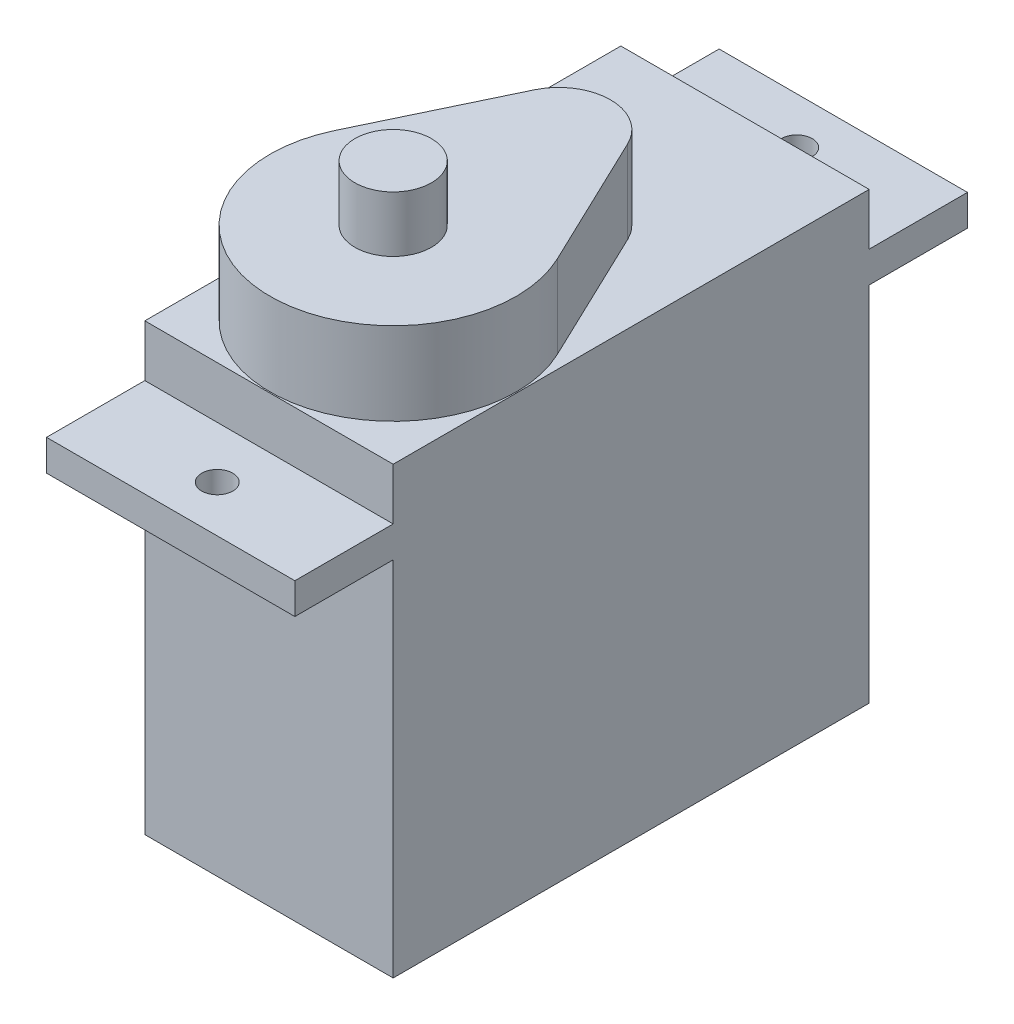
ISO-10303-21;
HEADER;
FILE_DESCRIPTION(('STEP AP214'),'2;1');
FILE_NAME('part.step','',(''),(''),'','','');
FILE_SCHEMA(('AUTOMOTIVE_DESIGN { 1 0 10303 214 1 1 1 1 }'));
ENDSEC;
DATA;
#1=APPLICATION_CONTEXT('core data for automotive mechanical design processes');
#2=APPLICATION_PROTOCOL_DEFINITION('international standard','automotive_design',2000,#1);
#3=PRODUCT_CONTEXT('',#1,'mechanical');
#4=PRODUCT('Part','Part','',(#3));
#5=PRODUCT_RELATED_PRODUCT_CATEGORY('part','',(#4));
#6=PRODUCT_DEFINITION_FORMATION('','',#4);
#7=PRODUCT_DEFINITION_CONTEXT('part definition',#1,'design');
#8=PRODUCT_DEFINITION('design','',#6,#7);
#9=PRODUCT_DEFINITION_SHAPE('','',#8);
#10=(LENGTH_UNIT() NAMED_UNIT(*) SI_UNIT(.MILLI.,.METRE.));
#11=(NAMED_UNIT(*) PLANE_ANGLE_UNIT() SI_UNIT($,.RADIAN.));
#12=(NAMED_UNIT(*) SI_UNIT($,.STERADIAN.) SOLID_ANGLE_UNIT());
#13=UNCERTAINTY_MEASURE_WITH_UNIT(LENGTH_MEASURE(1.E-05),#10,'distance_accuracy_value','');
#14=(GEOMETRIC_REPRESENTATION_CONTEXT(3) GLOBAL_UNCERTAINTY_ASSIGNED_CONTEXT((#13)) GLOBAL_UNIT_ASSIGNED_CONTEXT((#10,
#11,#12)) REPRESENTATION_CONTEXT('',''));
#15=CARTESIAN_POINT('',(0.,0.,0.));
#16=DIRECTION('',(0.,0.,1.));
#17=DIRECTION('',(1.,0.,0.));
#18=AXIS2_PLACEMENT_3D('',#15,#16,#17);
#19=CARTESIAN_POINT('',(12.,21.5,0.));
#20=DIRECTION('',(0.,-1.,0.));
#21=DIRECTION('',(0.,0.,-1.));
#22=AXIS2_PLACEMENT_3D('',#19,#20,#21);
#23=PLANE('',#22);
#24=DIRECTION('',(0.,0.,1.));
#25=VECTOR('',#24,1.);
#26=CARTESIAN_POINT('',(0.,21.5,0.));
#27=LINE('',#26,#25);
#28=CARTESIAN_POINT('',(0.,21.5,-23.));
#29=VERTEX_POINT('',#28);
#30=CARTESIAN_POINT('',(0.,21.5,0.));
#31=VERTEX_POINT('',#30);
#32=EDGE_CURVE('E244',#29,#31,#27,.T.);
#33=ORIENTED_EDGE('',*,*,#32,.T.);
#34=DIRECTION('',(-1.,0.,0.));
#35=VECTOR('',#34,1.);
#36=CARTESIAN_POINT('',(12.,21.5,0.));
#37=LINE('',#36,#35);
#38=CARTESIAN_POINT('',(12.,21.5,0.));
#39=VERTEX_POINT('',#38);
#40=EDGE_CURVE('E273',#39,#31,#37,.T.);
#41=ORIENTED_EDGE('',*,*,#40,.F.);
#42=DIRECTION('',(0.,0.,1.));
#43=VECTOR('',#42,1.);
#44=CARTESIAN_POINT('',(12.,21.5,0.));
#45=LINE('',#44,#43);
#46=CARTESIAN_POINT('',(12.,21.5,-23.));
#47=VERTEX_POINT('',#46);
#48=EDGE_CURVE('E211',#47,#39,#45,.T.);
#49=ORIENTED_EDGE('',*,*,#48,.F.);
#50=DIRECTION('',(-1.,0.,0.));
#51=VECTOR('',#50,1.);
#52=CARTESIAN_POINT('',(12.,21.5,-23.));
#53=LINE('',#52,#51);
#54=EDGE_CURVE('E277',#47,#29,#53,.T.);
#55=ORIENTED_EDGE('',*,*,#54,.T.);
#56=EDGE_LOOP('',(#33,#41,#49,#55));
#57=FACE_BOUND('',#56,.T.);
#58=CARTESIAN_POINT('',(6.,21.5,-14.));
#59=DIRECTION('',(0.,1.,0.));
#60=DIRECTION('',(0.,0.,1.));
#61=AXIS2_PLACEMENT_3D('',#58,#59,#60);
#62=CIRCLE('',#61,2.5);
#63=CARTESIAN_POINT('',(8.25558118549854,21.5,-15.078125));
#64=VERTEX_POINT('',#63);
#65=CARTESIAN_POINT('',(3.74441881450146,21.5,-15.078125));
#66=VERTEX_POINT('',#65);
#67=EDGE_CURVE('E56',#64,#66,#62,.T.);
#68=ORIENTED_EDGE('',*,*,#67,.F.);
#69=DIRECTION('',(-0.43125,0.,-0.902232474199416));
#70=VECTOR('',#69,1.);
#71=CARTESIAN_POINT('',(8.25558118549854,21.5,-15.078125));
#72=LINE('',#71,#70);
#73=CARTESIAN_POINT('',(11.3682832214865,21.5,-8.5659375));
#74=VERTEX_POINT('',#73);
#75=EDGE_CURVE('E60',#74,#64,#72,.T.);
#76=ORIENTED_EDGE('',*,*,#75,.F.);
#77=CARTESIAN_POINT('',(6.,21.5,-6.));
#78=DIRECTION('',(0.,1.,0.));
#79=DIRECTION('',(0.,0.,1.));
#80=AXIS2_PLACEMENT_3D('',#77,#78,#79);
#81=CIRCLE('',#80,5.95);
#82=CARTESIAN_POINT('',(0.631716778513474,21.5,-8.5659375));
#83=VERTEX_POINT('',#82);
#84=EDGE_CURVE('E457',#83,#74,#81,.T.);
#85=ORIENTED_EDGE('',*,*,#84,.F.);
#86=DIRECTION('',(-0.43125,0.,0.902232474199416));
#87=VECTOR('',#86,1.);
#88=CARTESIAN_POINT('',(3.74441881450146,21.5,-15.078125));
#89=LINE('',#88,#87);
#90=EDGE_CURVE('E454',#66,#83,#89,.T.);
#91=ORIENTED_EDGE('',*,*,#90,.F.);
#92=EDGE_LOOP('',(#68,#76,#85,#91));
#93=FACE_BOUND('',#92,.T.);
#94=ADVANCED_FACE('F39',(#57,#93),#23,.F.);
#95=CARTESIAN_POINT('',(12.,0.,0.));
#96=DIRECTION('',(0.,0.,-1.));
#97=DIRECTION('',(-1.,0.,0.));
#98=AXIS2_PLACEMENT_3D('',#95,#96,#97);
#99=PLANE('',#98);
#100=DIRECTION('',(0.,-1.,0.));
#101=VECTOR('',#100,1.);
#102=CARTESIAN_POINT('',(0.,0.,0.));
#103=LINE('',#102,#101);
#104=CARTESIAN_POINT('',(0.,17.5,0.));
#105=VERTEX_POINT('',#104);
#106=CARTESIAN_POINT('',(0.,0.,0.));
#107=VERTEX_POINT('',#106);
#108=EDGE_CURVE('E177',#105,#107,#103,.T.);
#109=ORIENTED_EDGE('',*,*,#108,.T.);
#110=DIRECTION('',(-1.,0.,0.));
#111=VECTOR('',#110,1.);
#112=CARTESIAN_POINT('',(12.,0.,0.));
#113=LINE('',#112,#111);
#114=CARTESIAN_POINT('',(12.,0.,0.));
#115=VERTEX_POINT('',#114);
#116=EDGE_CURVE('E11',#115,#107,#113,.T.);
#117=ORIENTED_EDGE('',*,*,#116,.F.);
#118=DIRECTION('',(0.,-1.,0.));
#119=VECTOR('',#118,1.);
#120=CARTESIAN_POINT('',(12.,0.,0.));
#121=LINE('',#120,#119);
#122=CARTESIAN_POINT('',(12.,17.5,0.));
#123=VERTEX_POINT('',#122);
#124=EDGE_CURVE('E188',#123,#115,#121,.T.);
#125=ORIENTED_EDGE('',*,*,#124,.F.);
#126=DIRECTION('',(-1.,0.,0.));
#127=VECTOR('',#126,1.);
#128=CARTESIAN_POINT('',(12.,17.5,0.));
#129=LINE('',#128,#127);
#130=EDGE_CURVE('E225',#123,#105,#129,.T.);
#131=ORIENTED_EDGE('',*,*,#130,.T.);
#132=EDGE_LOOP('',(#109,#117,#125,#131));
#133=FACE_BOUND('',#132,.T.);
#134=ADVANCED_FACE('F41',(#133),#99,.F.);
#135=CARTESIAN_POINT('',(12.,0.,0.));
#136=DIRECTION('',(0.,1.,0.));
#137=DIRECTION('',(0.,0.,1.));
#138=AXIS2_PLACEMENT_3D('',#135,#136,#137);
#139=PLANE('',#138);
#140=DIRECTION('',(0.,0.,-1.));
#141=VECTOR('',#140,1.);
#142=CARTESIAN_POINT('',(0.,0.,0.));
#143=LINE('',#142,#141);
#144=CARTESIAN_POINT('',(0.,0.,-23.));
#145=VERTEX_POINT('',#144);
#146=EDGE_CURVE('E182',#107,#145,#143,.T.);
#147=ORIENTED_EDGE('',*,*,#146,.T.);
#148=DIRECTION('',(-1.,0.,0.));
#149=VECTOR('',#148,1.);
#150=CARTESIAN_POINT('',(12.,0.,-23.));
#151=LINE('',#150,#149);
#152=CARTESIAN_POINT('',(12.,0.,-23.));
#153=VERTEX_POINT('',#152);
#154=EDGE_CURVE('E49',#153,#145,#151,.T.);
#155=ORIENTED_EDGE('',*,*,#154,.F.);
#156=DIRECTION('',(0.,0.,-1.));
#157=VECTOR('',#156,1.);
#158=CARTESIAN_POINT('',(12.,0.,0.));
#159=LINE('',#158,#157);
#160=EDGE_CURVE('E192',#115,#153,#159,.T.);
#161=ORIENTED_EDGE('',*,*,#160,.F.);
#162=ORIENTED_EDGE('',*,*,#116,.T.);
#163=EDGE_LOOP('',(#147,#155,#161,#162));
#164=FACE_BOUND('',#163,.T.);
#165=ADVANCED_FACE('F326',(#164),#139,.F.);
#166=CARTESIAN_POINT('',(12.,0.,-23.));
#167=DIRECTION('',(0.,0.,1.));
#168=DIRECTION('',(0.,-1.,0.));
#169=AXIS2_PLACEMENT_3D('',#166,#167,#168);
#170=PLANE('',#169);
#171=DIRECTION('',(0.,1.,0.));
#172=VECTOR('',#171,1.);
#173=CARTESIAN_POINT('',(0.,0.,-23.));
#174=LINE('',#173,#172);
#175=CARTESIAN_POINT('',(0.,17.5,-23.));
#176=VERTEX_POINT('',#175);
#177=EDGE_CURVE('E229',#145,#176,#174,.T.);
#178=ORIENTED_EDGE('',*,*,#177,.T.);
#179=DIRECTION('',(-1.,0.,0.));
#180=VECTOR('',#179,1.);
#181=CARTESIAN_POINT('',(12.,17.5,-23.));
#182=LINE('',#181,#180);
#183=CARTESIAN_POINT('',(12.,17.5,-23.));
#184=VERTEX_POINT('',#183);
#185=EDGE_CURVE('E293',#184,#176,#182,.T.);
#186=ORIENTED_EDGE('',*,*,#185,.F.);
#187=DIRECTION('',(0.,1.,0.));
#188=VECTOR('',#187,1.);
#189=CARTESIAN_POINT('',(12.,0.,-23.));
#190=LINE('',#189,#188);
#191=EDGE_CURVE('E196',#153,#184,#190,.T.);
#192=ORIENTED_EDGE('',*,*,#191,.F.);
#193=ORIENTED_EDGE('',*,*,#154,.T.);
#194=EDGE_LOOP('',(#178,#186,#192,#193));
#195=FACE_BOUND('',#194,.T.);
#196=ADVANCED_FACE('F303',(#195),#170,.F.);
#197=CARTESIAN_POINT('',(12.,17.5,-23.));
#198=DIRECTION('',(0.,1.,0.));
#199=DIRECTION('',(0.,0.,1.));
#200=AXIS2_PLACEMENT_3D('',#197,#198,#199);
#201=PLANE('',#200);
#202=CARTESIAN_POINT('',(6.,17.5,-25.5));
#203=DIRECTION('',(0.,1.,0.));
#204=DIRECTION('',(0.,0.,1.));
#205=AXIS2_PLACEMENT_3D('',#202,#203,#204);
#206=CIRCLE('',#205,0.75);
#207=CARTESIAN_POINT('',(6.,17.5,-24.75));
#208=VERTEX_POINT('',#207);
#209=EDGE_CURVE('E428',#208,#208,#206,.T.);
#210=ORIENTED_EDGE('',*,*,#209,.T.);
#211=EDGE_LOOP('',(#210));
#212=FACE_BOUND('',#211,.T.);
#213=DIRECTION('',(0.,0.,-1.));
#214=VECTOR('',#213,1.);
#215=CARTESIAN_POINT('',(0.,17.5,-23.));
#216=LINE('',#215,#214);
#217=CARTESIAN_POINT('',(0.,17.5,-27.75));
#218=VERTEX_POINT('',#217);
#219=EDGE_CURVE('E232',#176,#218,#216,.T.);
#220=ORIENTED_EDGE('',*,*,#219,.T.);
#221=DIRECTION('',(-1.,0.,0.));
#222=VECTOR('',#221,1.);
#223=CARTESIAN_POINT('',(12.,17.5,-27.75));
#224=LINE('',#223,#222);
#225=CARTESIAN_POINT('',(12.,17.5,-27.75));
#226=VERTEX_POINT('',#225);
#227=EDGE_CURVE('E289',#226,#218,#224,.T.);
#228=ORIENTED_EDGE('',*,*,#227,.F.);
#229=DIRECTION('',(0.,0.,-1.));
#230=VECTOR('',#229,1.);
#231=CARTESIAN_POINT('',(12.,17.5,-23.));
#232=LINE('',#231,#230);
#233=EDGE_CURVE('E199',#184,#226,#232,.T.);
#234=ORIENTED_EDGE('',*,*,#233,.F.);
#235=ORIENTED_EDGE('',*,*,#185,.T.);
#236=EDGE_LOOP('',(#220,#228,#234,#235));
#237=FACE_BOUND('',#236,.T.);
#238=ADVANCED_FACE('F314',(#212,#237),#201,.F.);
#239=CARTESIAN_POINT('',(12.,19.,-27.75));
#240=DIRECTION('',(0.,0.,1.));
#241=DIRECTION('',(1.,0.,0.));
#242=AXIS2_PLACEMENT_3D('',#239,#240,#241);
#243=PLANE('',#242);
#244=DIRECTION('',(0.,1.,0.));
#245=VECTOR('',#244,1.);
#246=CARTESIAN_POINT('',(0.,19.,-27.75));
#247=LINE('',#246,#245);
#248=CARTESIAN_POINT('',(0.,19.,-27.75));
#249=VERTEX_POINT('',#248);
#250=EDGE_CURVE('E235',#218,#249,#247,.T.);
#251=ORIENTED_EDGE('',*,*,#250,.T.);
#252=DIRECTION('',(-1.,0.,0.));
#253=VECTOR('',#252,1.);
#254=CARTESIAN_POINT('',(12.,19.,-27.75));
#255=LINE('',#254,#253);
#256=CARTESIAN_POINT('',(12.,19.,-27.75));
#257=VERTEX_POINT('',#256);
#258=EDGE_CURVE('E285',#257,#249,#255,.T.);
#259=ORIENTED_EDGE('',*,*,#258,.F.);
#260=DIRECTION('',(0.,1.,0.));
#261=VECTOR('',#260,1.);
#262=CARTESIAN_POINT('',(12.,19.,-27.75));
#263=LINE('',#262,#261);
#264=EDGE_CURVE('E202',#226,#257,#263,.T.);
#265=ORIENTED_EDGE('',*,*,#264,.F.);
#266=ORIENTED_EDGE('',*,*,#227,.T.);
#267=EDGE_LOOP('',(#251,#259,#265,#266));
#268=FACE_BOUND('',#267,.T.);
#269=ADVANCED_FACE('F318',(#268),#243,.F.);
#270=CARTESIAN_POINT('',(12.,19.,-23.));
#271=DIRECTION('',(0.,-1.,0.));
#272=DIRECTION('',(0.,0.,-1.));
#273=AXIS2_PLACEMENT_3D('',#270,#271,#272);
#274=PLANE('',#273);
#275=CARTESIAN_POINT('',(6.,19.,-25.5));
#276=DIRECTION('',(0.,1.,0.));
#277=DIRECTION('',(0.,0.,1.));
#278=AXIS2_PLACEMENT_3D('',#275,#276,#277);
#279=CIRCLE('',#278,0.75);
#280=CARTESIAN_POINT('',(6.,19.,-24.75));
#281=VERTEX_POINT('',#280);
#282=EDGE_CURVE('E434',#281,#281,#279,.T.);
#283=ORIENTED_EDGE('',*,*,#282,.F.);
#284=EDGE_LOOP('',(#283));
#285=FACE_BOUND('',#284,.T.);
#286=DIRECTION('',(0.,0.,1.));
#287=VECTOR('',#286,1.);
#288=CARTESIAN_POINT('',(0.,19.,-23.));
#289=LINE('',#288,#287);
#290=CARTESIAN_POINT('',(0.,19.,-23.));
#291=VERTEX_POINT('',#290);
#292=EDGE_CURVE('E238',#249,#291,#289,.T.);
#293=ORIENTED_EDGE('',*,*,#292,.T.);
#294=DIRECTION('',(-1.,0.,0.));
#295=VECTOR('',#294,1.);
#296=CARTESIAN_POINT('',(12.,19.,-23.));
#297=LINE('',#296,#295);
#298=CARTESIAN_POINT('',(12.,19.,-23.));
#299=VERTEX_POINT('',#298);
#300=EDGE_CURVE('E281',#299,#291,#297,.T.);
#301=ORIENTED_EDGE('',*,*,#300,.F.);
#302=DIRECTION('',(0.,0.,1.));
#303=VECTOR('',#302,1.);
#304=CARTESIAN_POINT('',(12.,19.,-23.));
#305=LINE('',#304,#303);
#306=EDGE_CURVE('E205',#257,#299,#305,.T.);
#307=ORIENTED_EDGE('',*,*,#306,.F.);
#308=ORIENTED_EDGE('',*,*,#258,.T.);
#309=EDGE_LOOP('',(#293,#301,#307,#308));
#310=FACE_BOUND('',#309,.T.);
#311=ADVANCED_FACE('F358',(#285,#310),#274,.F.);
#312=CARTESIAN_POINT('',(12.,19.,-23.));
#313=DIRECTION('',(0.,0.,1.));
#314=DIRECTION('',(1.,0.,0.));
#315=AXIS2_PLACEMENT_3D('',#312,#313,#314);
#316=PLANE('',#315);
#317=DIRECTION('',(0.,1.,0.));
#318=VECTOR('',#317,1.);
#319=CARTESIAN_POINT('',(0.,19.,-23.));
#320=LINE('',#319,#318);
#321=EDGE_CURVE('E241',#291,#29,#320,.T.);
#322=ORIENTED_EDGE('',*,*,#321,.T.);
#323=ORIENTED_EDGE('',*,*,#54,.F.);
#324=DIRECTION('',(0.,1.,0.));
#325=VECTOR('',#324,1.);
#326=CARTESIAN_POINT('',(12.,19.,-23.));
#327=LINE('',#326,#325);
#328=EDGE_CURVE('E208',#299,#47,#327,.T.);
#329=ORIENTED_EDGE('',*,*,#328,.F.);
#330=ORIENTED_EDGE('',*,*,#300,.T.);
#331=EDGE_LOOP('',(#322,#323,#329,#330));
#332=FACE_BOUND('',#331,.T.);
#333=ADVANCED_FACE('F356',(#332),#316,.F.);
#334=CARTESIAN_POINT('',(12.,19.,0.));
#335=DIRECTION('',(0.,0.,-1.));
#336=DIRECTION('',(-1.,0.,0.));
#337=AXIS2_PLACEMENT_3D('',#334,#335,#336);
#338=PLANE('',#337);
#339=DIRECTION('',(0.,-1.,0.));
#340=VECTOR('',#339,1.);
#341=CARTESIAN_POINT('',(0.,19.,0.));
#342=LINE('',#341,#340);
#343=CARTESIAN_POINT('',(0.,19.,0.));
#344=VERTEX_POINT('',#343);
#345=EDGE_CURVE('E247',#31,#344,#342,.T.);
#346=ORIENTED_EDGE('',*,*,#345,.T.);
#347=DIRECTION('',(-1.,0.,0.));
#348=VECTOR('',#347,1.);
#349=CARTESIAN_POINT('',(12.,19.,0.));
#350=LINE('',#349,#348);
#351=CARTESIAN_POINT('',(12.,19.,0.));
#352=VERTEX_POINT('',#351);
#353=EDGE_CURVE('E269',#352,#344,#350,.T.);
#354=ORIENTED_EDGE('',*,*,#353,.F.);
#355=DIRECTION('',(0.,-1.,0.));
#356=VECTOR('',#355,1.);
#357=CARTESIAN_POINT('',(12.,19.,0.));
#358=LINE('',#357,#356);
#359=EDGE_CURVE('E214',#39,#352,#358,.T.);
#360=ORIENTED_EDGE('',*,*,#359,.F.);
#361=ORIENTED_EDGE('',*,*,#40,.T.);
#362=EDGE_LOOP('',(#346,#354,#360,#361));
#363=FACE_BOUND('',#362,.T.);
#364=ADVANCED_FACE('F348',(#363),#338,.F.);
#365=CARTESIAN_POINT('',(12.,19.,0.));
#366=DIRECTION('',(0.,-1.,0.));
#367=DIRECTION('',(0.,0.,-1.));
#368=AXIS2_PLACEMENT_3D('',#365,#366,#367);
#369=PLANE('',#368);
#370=CARTESIAN_POINT('',(6.,19.,2.5));
#371=DIRECTION('',(0.,1.,0.));
#372=DIRECTION('',(0.,0.,1.));
#373=AXIS2_PLACEMENT_3D('',#370,#371,#372);
#374=CIRCLE('',#373,0.75);
#375=CARTESIAN_POINT('',(6.,19.,3.25));
#376=VERTEX_POINT('',#375);
#377=EDGE_CURVE('E424',#376,#376,#374,.T.);
#378=ORIENTED_EDGE('',*,*,#377,.F.);
#379=EDGE_LOOP('',(#378));
#380=FACE_BOUND('',#379,.T.);
#381=DIRECTION('',(0.,0.,1.));
#382=VECTOR('',#381,1.);
#383=CARTESIAN_POINT('',(0.,19.,0.));
#384=LINE('',#383,#382);
#385=CARTESIAN_POINT('',(0.,19.,4.75));
#386=VERTEX_POINT('',#385);
#387=EDGE_CURVE('E250',#344,#386,#384,.T.);
#388=ORIENTED_EDGE('',*,*,#387,.T.);
#389=DIRECTION('',(-1.,0.,0.));
#390=VECTOR('',#389,1.);
#391=CARTESIAN_POINT('',(12.,19.,4.75));
#392=LINE('',#391,#390);
#393=CARTESIAN_POINT('',(12.,19.,4.75));
#394=VERTEX_POINT('',#393);
#395=EDGE_CURVE('E265',#394,#386,#392,.T.);
#396=ORIENTED_EDGE('',*,*,#395,.F.);
#397=DIRECTION('',(0.,0.,1.));
#398=VECTOR('',#397,1.);
#399=CARTESIAN_POINT('',(12.,19.,0.));
#400=LINE('',#399,#398);
#401=EDGE_CURVE('E217',#352,#394,#400,.T.);
#402=ORIENTED_EDGE('',*,*,#401,.F.);
#403=ORIENTED_EDGE('',*,*,#353,.T.);
#404=EDGE_LOOP('',(#388,#396,#402,#403));
#405=FACE_BOUND('',#404,.T.);
#406=ADVANCED_FACE('F342',(#380,#405),#369,.F.);
#407=CARTESIAN_POINT('',(12.,19.,4.75));
#408=DIRECTION('',(0.,0.,-1.));
#409=DIRECTION('',(-1.,0.,0.));
#410=AXIS2_PLACEMENT_3D('',#407,#408,#409);
#411=PLANE('',#410);
#412=DIRECTION('',(0.,-1.,0.));
#413=VECTOR('',#412,1.);
#414=CARTESIAN_POINT('',(0.,19.,4.75));
#415=LINE('',#414,#413);
#416=CARTESIAN_POINT('',(0.,17.5,4.75));
#417=VERTEX_POINT('',#416);
#418=EDGE_CURVE('E253',#386,#417,#415,.T.);
#419=ORIENTED_EDGE('',*,*,#418,.T.);
#420=DIRECTION('',(-1.,0.,0.));
#421=VECTOR('',#420,1.);
#422=CARTESIAN_POINT('',(12.,17.5,4.75));
#423=LINE('',#422,#421);
#424=CARTESIAN_POINT('',(12.,17.5,4.75));
#425=VERTEX_POINT('',#424);
#426=EDGE_CURVE('E261',#425,#417,#423,.T.);
#427=ORIENTED_EDGE('',*,*,#426,.F.);
#428=DIRECTION('',(0.,-1.,0.));
#429=VECTOR('',#428,1.);
#430=CARTESIAN_POINT('',(12.,19.,4.75));
#431=LINE('',#430,#429);
#432=EDGE_CURVE('E220',#394,#425,#431,.T.);
#433=ORIENTED_EDGE('',*,*,#432,.F.);
#434=ORIENTED_EDGE('',*,*,#395,.T.);
#435=EDGE_LOOP('',(#419,#427,#433,#434));
#436=FACE_BOUND('',#435,.T.);
#437=ADVANCED_FACE('F338',(#436),#411,.F.);
#438=CARTESIAN_POINT('',(12.,17.5,0.));
#439=DIRECTION('',(0.,1.,0.));
#440=DIRECTION('',(0.,0.,1.));
#441=AXIS2_PLACEMENT_3D('',#438,#439,#440);
#442=PLANE('',#441);
#443=CARTESIAN_POINT('',(6.,17.5,2.5));
#444=DIRECTION('',(0.,1.,0.));
#445=DIRECTION('',(0.,0.,1.));
#446=AXIS2_PLACEMENT_3D('',#443,#444,#445);
#447=CIRCLE('',#446,0.75);
#448=CARTESIAN_POINT('',(6.,17.5,3.25));
#449=VERTEX_POINT('',#448);
#450=EDGE_CURVE('E43',#449,#449,#447,.T.);
#451=ORIENTED_EDGE('',*,*,#450,.T.);
#452=EDGE_LOOP('',(#451));
#453=FACE_BOUND('',#452,.T.);
#454=DIRECTION('',(0.,0.,-1.));
#455=VECTOR('',#454,1.);
#456=CARTESIAN_POINT('',(0.,17.5,0.));
#457=LINE('',#456,#455);
#458=EDGE_CURVE('E193',#417,#105,#457,.T.);
#459=ORIENTED_EDGE('',*,*,#458,.T.);
#460=ORIENTED_EDGE('',*,*,#130,.F.);
#461=DIRECTION('',(0.,0.,-1.));
#462=VECTOR('',#461,1.);
#463=CARTESIAN_POINT('',(12.,17.5,0.));
#464=LINE('',#463,#462);
#465=EDGE_CURVE('E223',#425,#123,#464,.T.);
#466=ORIENTED_EDGE('',*,*,#465,.F.);
#467=ORIENTED_EDGE('',*,*,#426,.T.);
#468=EDGE_LOOP('',(#459,#460,#466,#467));
#469=FACE_BOUND('',#468,.T.);
#470=ADVANCED_FACE('F333',(#453,#469),#442,.F.);
#471=CARTESIAN_POINT('',(12.,0.,0.));
#472=DIRECTION('',(1.,0.,0.));
#473=DIRECTION('',(0.,0.,-1.));
#474=AXIS2_PLACEMENT_3D('',#471,#472,#473);
#475=PLANE('',#474);
#476=ORIENTED_EDGE('',*,*,#124,.T.);
#477=ORIENTED_EDGE('',*,*,#160,.T.);
#478=ORIENTED_EDGE('',*,*,#191,.T.);
#479=ORIENTED_EDGE('',*,*,#233,.T.);
#480=ORIENTED_EDGE('',*,*,#264,.T.);
#481=ORIENTED_EDGE('',*,*,#306,.T.);
#482=ORIENTED_EDGE('',*,*,#328,.T.);
#483=ORIENTED_EDGE('',*,*,#48,.T.);
#484=ORIENTED_EDGE('',*,*,#359,.T.);
#485=ORIENTED_EDGE('',*,*,#401,.T.);
#486=ORIENTED_EDGE('',*,*,#432,.T.);
#487=ORIENTED_EDGE('',*,*,#465,.T.);
#488=EDGE_LOOP('',(#476,#477,#478,#479,#480,#481,#482,#483,#484,#485,#486,#487));
#489=FACE_BOUND('',#488,.T.);
#490=ADVANCED_FACE('F322',(#489),#475,.T.);
#491=CARTESIAN_POINT('',(0.,0.,0.));
#492=DIRECTION('',(1.,0.,0.));
#493=DIRECTION('',(0.,0.,-1.));
#494=AXIS2_PLACEMENT_3D('',#491,#492,#493);
#495=PLANE('',#494);
#496=ORIENTED_EDGE('',*,*,#108,.F.);
#497=ORIENTED_EDGE('',*,*,#458,.F.);
#498=ORIENTED_EDGE('',*,*,#418,.F.);
#499=ORIENTED_EDGE('',*,*,#387,.F.);
#500=ORIENTED_EDGE('',*,*,#345,.F.);
#501=ORIENTED_EDGE('',*,*,#32,.F.);
#502=ORIENTED_EDGE('',*,*,#321,.F.);
#503=ORIENTED_EDGE('',*,*,#292,.F.);
#504=ORIENTED_EDGE('',*,*,#250,.F.);
#505=ORIENTED_EDGE('',*,*,#219,.F.);
#506=ORIENTED_EDGE('',*,*,#177,.F.);
#507=ORIENTED_EDGE('',*,*,#146,.F.);
#508=EDGE_LOOP('',(#496,#497,#498,#499,#500,#501,#502,#503,#504,#505,#506,#507));
#509=FACE_BOUND('',#508,.T.);
#510=ADVANCED_FACE('F309',(#509),#495,.F.);
#511=CARTESIAN_POINT('',(6.,25.5,-14.));
#512=DIRECTION('',(0.,-1.,0.));
#513=DIRECTION('',(0.,0.,-1.));
#514=AXIS2_PLACEMENT_3D('',#511,#512,#513);
#515=CYLINDRICAL_SURFACE('',#514,2.5);
#516=ORIENTED_EDGE('',*,*,#67,.T.);
#517=DIRECTION('',(0.,-1.,0.));
#518=VECTOR('',#517,1.);
#519=CARTESIAN_POINT('',(3.74441881450146,25.5,-15.078125));
#520=LINE('',#519,#518);
#521=CARTESIAN_POINT('',(3.74441881450146,25.5,-15.078125));
#522=VERTEX_POINT('',#521);
#523=EDGE_CURVE('E157',#522,#66,#520,.T.);
#524=ORIENTED_EDGE('',*,*,#523,.F.);
#525=CARTESIAN_POINT('',(6.,25.5,-14.));
#526=DIRECTION('',(0.,1.,0.));
#527=DIRECTION('',(0.,0.,1.));
#528=AXIS2_PLACEMENT_3D('',#525,#526,#527);
#529=CIRCLE('',#528,2.5);
#530=CARTESIAN_POINT('',(8.25558118549854,25.5,-15.078125));
#531=VERTEX_POINT('',#530);
#532=EDGE_CURVE('E164',#531,#522,#529,.T.);
#533=ORIENTED_EDGE('',*,*,#532,.F.);
#534=DIRECTION('',(0.,-1.,0.));
#535=VECTOR('',#534,1.);
#536=CARTESIAN_POINT('',(8.25558118549854,25.5,-15.078125));
#537=LINE('',#536,#535);
#538=EDGE_CURVE('E451',#531,#64,#537,.T.);
#539=ORIENTED_EDGE('',*,*,#538,.T.);
#540=EDGE_LOOP('',(#516,#524,#533,#539));
#541=FACE_BOUND('',#540,.T.);
#542=ADVANCED_FACE('F175',(#541),#515,.T.);
#543=CARTESIAN_POINT('',(3.74441881450146,25.5,-15.078125));
#544=DIRECTION('',(0.902232474199416,0.,0.43125));
#545=DIRECTION('',(0.43125,0.,-0.902232474199416));
#546=AXIS2_PLACEMENT_3D('',#543,#544,#545);
#547=PLANE('',#546);
#548=ORIENTED_EDGE('',*,*,#90,.T.);
#549=DIRECTION('',(0.,-1.,0.));
#550=VECTOR('',#549,1.);
#551=CARTESIAN_POINT('',(0.631716778513474,25.5,-8.5659375));
#552=LINE('',#551,#550);
#553=CARTESIAN_POINT('',(0.631716778513474,25.5,-8.5659375));
#554=VERTEX_POINT('',#553);
#555=EDGE_CURVE('E159',#554,#83,#552,.T.);
#556=ORIENTED_EDGE('',*,*,#555,.F.);
#557=DIRECTION('',(-0.43125,0.,0.902232474199416));
#558=VECTOR('',#557,1.);
#559=CARTESIAN_POINT('',(3.74441881450146,25.5,-15.078125));
#560=LINE('',#559,#558);
#561=EDGE_CURVE('E152',#522,#554,#560,.T.);
#562=ORIENTED_EDGE('',*,*,#561,.F.);
#563=ORIENTED_EDGE('',*,*,#523,.T.);
#564=EDGE_LOOP('',(#548,#556,#562,#563));
#565=FACE_BOUND('',#564,.T.);
#566=ADVANCED_FACE('F155',(#565),#547,.F.);
#567=CARTESIAN_POINT('',(6.,25.5,-6.));
#568=DIRECTION('',(0.,-1.,0.));
#569=DIRECTION('',(0.,0.,-1.));
#570=AXIS2_PLACEMENT_3D('',#567,#568,#569);
#571=CYLINDRICAL_SURFACE('',#570,5.95);
#572=ORIENTED_EDGE('',*,*,#84,.T.);
#573=DIRECTION('',(0.,-1.,0.));
#574=VECTOR('',#573,1.);
#575=CARTESIAN_POINT('',(11.3682832214865,25.5,-8.5659375));
#576=LINE('',#575,#574);
#577=CARTESIAN_POINT('',(11.3682832214865,25.5,-8.5659375));
#578=VERTEX_POINT('',#577);
#579=EDGE_CURVE('E184',#578,#74,#576,.T.);
#580=ORIENTED_EDGE('',*,*,#579,.F.);
#581=CARTESIAN_POINT('',(6.,25.5,-6.));
#582=DIRECTION('',(0.,1.,0.));
#583=DIRECTION('',(0.,0.,1.));
#584=AXIS2_PLACEMENT_3D('',#581,#582,#583);
#585=CIRCLE('',#584,5.95);
#586=EDGE_CURVE('E163',#554,#578,#585,.T.);
#587=ORIENTED_EDGE('',*,*,#586,.F.);
#588=ORIENTED_EDGE('',*,*,#555,.T.);
#589=EDGE_LOOP('',(#572,#580,#587,#588));
#590=FACE_BOUND('',#589,.T.);
#591=ADVANCED_FACE('F393',(#590),#571,.T.);
#592=CARTESIAN_POINT('',(8.25558118549854,25.5,-15.078125));
#593=DIRECTION('',(-0.902232474199416,0.,0.43125));
#594=DIRECTION('',(0.43125,0.,0.902232474199416));
#595=AXIS2_PLACEMENT_3D('',#592,#593,#594);
#596=PLANE('',#595);
#597=ORIENTED_EDGE('',*,*,#75,.T.);
#598=ORIENTED_EDGE('',*,*,#538,.F.);
#599=DIRECTION('',(-0.43125,0.,-0.902232474199416));
#600=VECTOR('',#599,1.);
#601=CARTESIAN_POINT('',(8.25558118549854,25.5,-15.078125));
#602=LINE('',#601,#600);
#603=EDGE_CURVE('E169',#578,#531,#602,.T.);
#604=ORIENTED_EDGE('',*,*,#603,.F.);
#605=ORIENTED_EDGE('',*,*,#579,.T.);
#606=EDGE_LOOP('',(#597,#598,#604,#605));
#607=FACE_BOUND('',#606,.T.);
#608=ADVANCED_FACE('F396',(#607),#596,.F.);
#609=CARTESIAN_POINT('',(6.,25.5,-14.));
#610=DIRECTION('',(0.,1.,0.));
#611=DIRECTION('',(0.,0.,1.));
#612=AXIS2_PLACEMENT_3D('',#609,#610,#611);
#613=PLANE('',#612);
#614=CARTESIAN_POINT('',(6.,25.5,-6.));
#615=DIRECTION('',(0.,1.,0.));
#616=DIRECTION('',(0.,0.,1.));
#617=AXIS2_PLACEMENT_3D('',#614,#615,#616);
#618=CIRCLE('',#617,1.85);
#619=CARTESIAN_POINT('',(6.,25.5,-7.85));
#620=VERTEX_POINT('',#619);
#621=EDGE_CURVE('E432',#620,#620,#618,.T.);
#622=ORIENTED_EDGE('',*,*,#621,.F.);
#623=EDGE_LOOP('',(#622));
#624=FACE_BOUND('',#623,.T.);
#625=ORIENTED_EDGE('',*,*,#532,.T.);
#626=ORIENTED_EDGE('',*,*,#561,.T.);
#627=ORIENTED_EDGE('',*,*,#586,.T.);
#628=ORIENTED_EDGE('',*,*,#603,.T.);
#629=EDGE_LOOP('',(#625,#626,#627,#628));
#630=FACE_BOUND('',#629,.T.);
#631=ADVANCED_FACE('F167',(#624,#630),#613,.T.);
#632=CARTESIAN_POINT('',(6.,28.2,-6.));
#633=DIRECTION('',(0.,-1.,0.));
#634=DIRECTION('',(0.,0.,-1.));
#635=AXIS2_PLACEMENT_3D('',#632,#633,#634);
#636=CYLINDRICAL_SURFACE('',#635,1.85);
#637=CARTESIAN_POINT('',(6.,28.2,-6.));
#638=DIRECTION('',(0.,1.,0.));
#639=DIRECTION('',(0.,0.,1.));
#640=AXIS2_PLACEMENT_3D('',#637,#638,#639);
#641=CIRCLE('',#640,1.85);
#642=CARTESIAN_POINT('',(6.,28.2,-7.85));
#643=VERTEX_POINT('',#642);
#644=EDGE_CURVE('E440',#643,#643,#641,.T.);
#645=CARTESIAN_POINT('',(6.,28.2,-7.85));
#646=CARTESIAN_POINT('',(6.,28.171875,-7.85));
#647=CARTESIAN_POINT('',(6.,28.14375,-7.85));
#648=CARTESIAN_POINT('',(6.,28.0875,-7.85));
#649=CARTESIAN_POINT('',(6.,28.059375,-7.85));
#650=CARTESIAN_POINT('',(6.,28.003125,-7.85));
#651=CARTESIAN_POINT('',(6.,27.975,-7.85));
#652=CARTESIAN_POINT('',(6.,27.91875,-7.85));
#653=CARTESIAN_POINT('',(6.,27.890625,-7.85));
#654=CARTESIAN_POINT('',(6.,27.834375,-7.85));
#655=CARTESIAN_POINT('',(6.,27.80625,-7.85));
#656=CARTESIAN_POINT('',(6.,27.75,-7.85));
#657=CARTESIAN_POINT('',(6.,27.721875,-7.85));
#658=CARTESIAN_POINT('',(6.,27.665625,-7.85));
#659=CARTESIAN_POINT('',(6.,27.6375,-7.85));
#660=CARTESIAN_POINT('',(6.,27.58125,-7.85));
#661=CARTESIAN_POINT('',(6.,27.553125,-7.85));
#662=CARTESIAN_POINT('',(6.,27.496875,-7.85));
#663=CARTESIAN_POINT('',(6.,27.46875,-7.85));
#664=CARTESIAN_POINT('',(6.,27.4125,-7.85));
#665=CARTESIAN_POINT('',(6.,27.384375,-7.85));
#666=CARTESIAN_POINT('',(6.,27.328125,-7.85));
#667=CARTESIAN_POINT('',(6.,27.3,-7.85));
#668=CARTESIAN_POINT('',(6.,27.24375,-7.85));
#669=CARTESIAN_POINT('',(6.,27.215625,-7.85));
#670=CARTESIAN_POINT('',(6.,27.159375,-7.85));
#671=CARTESIAN_POINT('',(6.,27.13125,-7.85));
#672=CARTESIAN_POINT('',(6.,27.075,-7.85));
#673=CARTESIAN_POINT('',(6.,27.046875,-7.85));
#674=CARTESIAN_POINT('',(6.,26.990625,-7.85));
#675=CARTESIAN_POINT('',(6.,26.9625,-7.85));
#676=CARTESIAN_POINT('',(6.,26.90625,-7.85));
#677=CARTESIAN_POINT('',(6.,26.878125,-7.85));
#678=CARTESIAN_POINT('',(6.,26.821875,-7.85));
#679=CARTESIAN_POINT('',(6.,26.79375,-7.85));
#680=CARTESIAN_POINT('',(6.,26.7375,-7.85));
#681=CARTESIAN_POINT('',(6.,26.709375,-7.85));
#682=CARTESIAN_POINT('',(6.,26.653125,-7.85));
#683=CARTESIAN_POINT('',(6.,26.625,-7.85));
#684=CARTESIAN_POINT('',(6.,26.56875,-7.85));
#685=CARTESIAN_POINT('',(6.,26.540625,-7.85));
#686=CARTESIAN_POINT('',(6.,26.484375,-7.85));
#687=CARTESIAN_POINT('',(6.,26.45625,-7.85));
#688=CARTESIAN_POINT('',(6.,26.4,-7.85));
#689=CARTESIAN_POINT('',(6.,26.371875,-7.85));
#690=CARTESIAN_POINT('',(6.,26.315625,-7.85));
#691=CARTESIAN_POINT('',(6.,26.2875,-7.85));
#692=CARTESIAN_POINT('',(6.,26.23125,-7.85));
#693=CARTESIAN_POINT('',(6.,26.203125,-7.85));
#694=CARTESIAN_POINT('',(6.,26.146875,-7.85));
#695=CARTESIAN_POINT('',(6.,26.11875,-7.85));
#696=CARTESIAN_POINT('',(6.,26.0625,-7.85));
#697=CARTESIAN_POINT('',(6.,26.034375,-7.85));
#698=CARTESIAN_POINT('',(6.,25.978125,-7.85));
#699=CARTESIAN_POINT('',(6.,25.95,-7.85));
#700=CARTESIAN_POINT('',(6.,25.89375,-7.85));
#701=CARTESIAN_POINT('',(6.,25.865625,-7.85));
#702=CARTESIAN_POINT('',(6.,25.809375,-7.85));
#703=CARTESIAN_POINT('',(6.,25.78125,-7.85));
#704=CARTESIAN_POINT('',(6.,25.725,-7.85));
#705=CARTESIAN_POINT('',(6.,25.696875,-7.85));
#706=CARTESIAN_POINT('',(6.,25.640625,-7.85));
#707=CARTESIAN_POINT('',(6.,25.6125,-7.85));
#708=CARTESIAN_POINT('',(6.,25.55625,-7.85));
#709=CARTESIAN_POINT('',(6.,25.528125,-7.85));
#710=CARTESIAN_POINT('',(6.,25.5,-7.85));
#711=B_SPLINE_CURVE_WITH_KNOTS('',3,(#645,#646,#647,#648,#649,#650,#651,#652,#653,#654,#655,
#656,#657,#658,#659,#660,#661,#662,#663,#664,#665,#666,#667,#668,#669,#670,#671,#672,#673,#674,
#675,#676,#677,#678,#679,#680,#681,#682,#683,#684,#685,#686,#687,#688,#689,#690,#691,#692,#693,
#694,#695,#696,#697,#698,#699,#700,#701,#702,#703,#704,#705,#706,#707,#708,#709,#710),
.UNSPECIFIED.,.F.,.F.,(4,2,2,2,2,2,2,2,2,2,2,2,2,2,2,2,2,2,2,2,2,2,2,2,2,2,2,2,2,2,2,2,4),(0.,
0.0843750000000011,0.168750000000002,0.253125000000003,0.337500000000001,0.421875000000002,
0.506250000000003,0.590625000000001,0.675000000000002,0.759375000000003,0.843750000000001,
0.928125000000002,1.0125,1.096875,1.18125,1.265625,1.35,1.434375,1.51875,1.603125,1.6875,
1.771875,1.85625,1.940625,2.025,2.109375,2.19375,2.278125,2.3625,2.446875,2.53125,2.615625,2.7),.UNSPECIFIED.);
#712=EDGE_CURVE('BSEAM403',#643,#620,#711,.T.);
#713=ORIENTED_EDGE('',*,*,#644,.F.);
#714=ORIENTED_EDGE('',*,*,#621,.T.);
#715=ORIENTED_EDGE('',*,*,#712,.T.);
#716=ORIENTED_EDGE('',*,*,#712,.F.);
#717=EDGE_LOOP('',(#713,#715,#714,#716));
#718=FACE_BOUND('',#717,.T.);
#719=ADVANCED_FACE('F403',(#718),#636,.T.);
#720=CARTESIAN_POINT('',(6.,28.2,-6.));
#721=DIRECTION('',(0.,1.,0.));
#722=DIRECTION('',(0.,0.,1.));
#723=AXIS2_PLACEMENT_3D('',#720,#721,#722);
#724=PLANE('',#723);
#725=ORIENTED_EDGE('',*,*,#644,.T.);
#726=EDGE_LOOP('',(#725));
#727=FACE_BOUND('',#726,.T.);
#728=ADVANCED_FACE('F407',(#727),#724,.T.);
#729=CARTESIAN_POINT('',(6.,0.,2.5));
#730=DIRECTION('',(0.,1.,0.));
#731=DIRECTION('',(0.,0.,1.));
#732=AXIS2_PLACEMENT_3D('',#729,#730,#731);
#733=CYLINDRICAL_SURFACE('',#732,0.75);
#734=ORIENTED_EDGE('',*,*,#377,.T.);
#735=EDGE_LOOP('',(#734));
#736=FACE_BOUND('',#735,.T.);
#737=ORIENTED_EDGE('',*,*,#450,.F.);
#738=EDGE_LOOP('',(#737));
#739=FACE_BOUND('',#738,.T.);
#740=ADVANCED_FACE('F411',(#736,#739),#733,.F.);
#741=CARTESIAN_POINT('',(6.,0.,-25.5));
#742=DIRECTION('',(0.,1.,0.));
#743=DIRECTION('',(0.,0.,1.));
#744=AXIS2_PLACEMENT_3D('',#741,#742,#743);
#745=CYLINDRICAL_SURFACE('',#744,0.75);
#746=ORIENTED_EDGE('',*,*,#282,.T.);
#747=EDGE_LOOP('',(#746));
#748=FACE_BOUND('',#747,.T.);
#749=ORIENTED_EDGE('',*,*,#209,.F.);
#750=EDGE_LOOP('',(#749));
#751=FACE_BOUND('',#750,.T.);
#752=ADVANCED_FACE('F413',(#748,#751),#745,.F.);
#753=CLOSED_SHELL('',(#94,#134,#165,#196,#238,#269,#311,#333,#364,#406,#437,#470,#490,#510,#542,
#566,#591,#608,#631,#719,#728,#740,#752));
#754=MANIFOLD_SOLID_BREP('B2',#753);
#755=ADVANCED_BREP_SHAPE_REPRESENTATION('',(#18,#754),#14);
#756=SHAPE_DEFINITION_REPRESENTATION(#9,#755);
ENDSEC;
END-ISO-10303-21;
